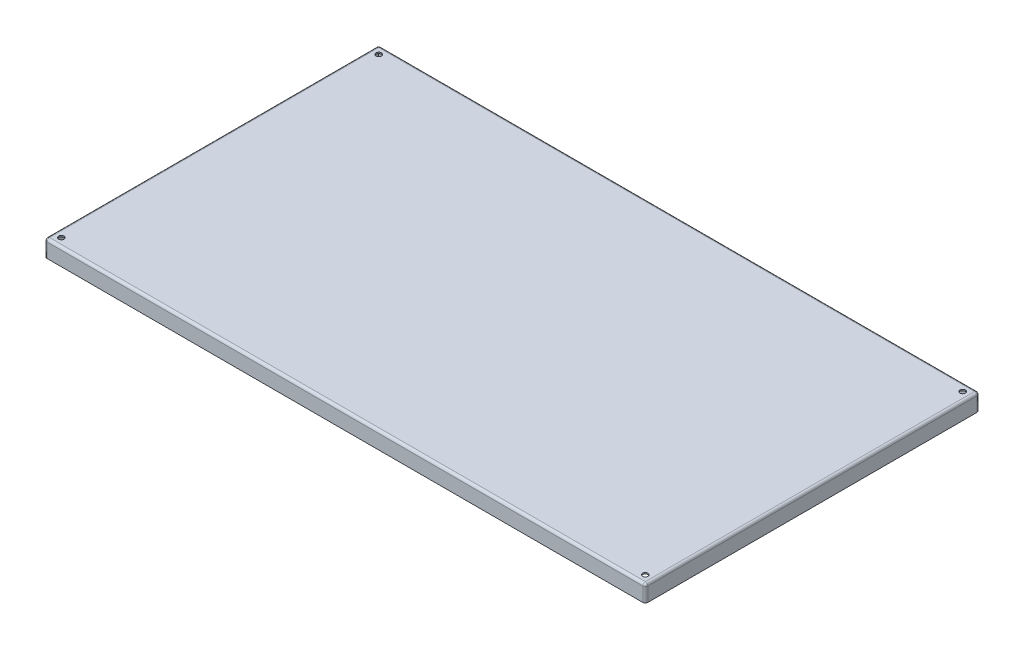
ISO-10303-21;
HEADER;
FILE_DESCRIPTION(('STEP AP214'),'2;1');
FILE_NAME('part.step','',(''),(''),'','','');
FILE_SCHEMA(('AUTOMOTIVE_DESIGN { 1 0 10303 214 1 1 1 1 }'));
ENDSEC;
DATA;
#1=APPLICATION_CONTEXT('core data for automotive mechanical design processes');
#2=APPLICATION_PROTOCOL_DEFINITION('international standard','automotive_design',2000,#1);
#3=PRODUCT_CONTEXT('',#1,'mechanical');
#4=PRODUCT('Part','Part','',(#3));
#5=PRODUCT_RELATED_PRODUCT_CATEGORY('part','',(#4));
#6=PRODUCT_DEFINITION_FORMATION('','',#4);
#7=PRODUCT_DEFINITION_CONTEXT('part definition',#1,'design');
#8=PRODUCT_DEFINITION('design','',#6,#7);
#9=PRODUCT_DEFINITION_SHAPE('','',#8);
#10=(LENGTH_UNIT() NAMED_UNIT(*) SI_UNIT(.MILLI.,.METRE.));
#11=(NAMED_UNIT(*) PLANE_ANGLE_UNIT() SI_UNIT($,.RADIAN.));
#12=(NAMED_UNIT(*) SI_UNIT($,.STERADIAN.) SOLID_ANGLE_UNIT());
#13=UNCERTAINTY_MEASURE_WITH_UNIT(LENGTH_MEASURE(1.E-05),#10,'distance_accuracy_value','');
#14=(GEOMETRIC_REPRESENTATION_CONTEXT(3) GLOBAL_UNCERTAINTY_ASSIGNED_CONTEXT((#13)) GLOBAL_UNIT_ASSIGNED_CONTEXT((#10,
#11,#12)) REPRESENTATION_CONTEXT('',''));
#15=CARTESIAN_POINT('',(0.,0.,0.));
#16=DIRECTION('',(0.,0.,1.));
#17=DIRECTION('',(1.,0.,0.));
#18=AXIS2_PLACEMENT_3D('',#15,#16,#17);
#19=CARTESIAN_POINT('',(-353.85,46.072,-195.5));
#20=DIRECTION('',(0.,-1.,0.));
#21=DIRECTION('',(0.,0.,-1.));
#22=AXIS2_PLACEMENT_3D('',#19,#20,#21);
#23=CYLINDRICAL_SURFACE('',#22,3.);
#24=CARTESIAN_POINT('',(-353.85,0.,-195.5));
#25=DIRECTION('',(0.,-1.,0.));
#26=DIRECTION('',(0.,0.,-1.));
#27=AXIS2_PLACEMENT_3D('',#24,#25,#26);
#28=CIRCLE('',#27,3.);
#29=CARTESIAN_POINT('',(-353.85,0.,-198.5));
#30=VERTEX_POINT('',#29);
#31=CARTESIAN_POINT('',(-356.85,0.,-195.5));
#32=VERTEX_POINT('',#31);
#33=EDGE_CURVE('E257',#30,#32,#28,.F.);
#34=ORIENTED_EDGE('',*,*,#33,.T.);
#35=DIRECTION('',(0.,1.,0.));
#36=VECTOR('',#35,1.);
#37=CARTESIAN_POINT('',(-356.85,0.,-195.5));
#38=LINE('',#37,#36);
#39=CARTESIAN_POINT('',(-356.85,17.0000000000202,-195.5));
#40=VERTEX_POINT('',#39);
#41=EDGE_CURVE('E177',#40,#32,#38,.F.);
#42=ORIENTED_EDGE('',*,*,#41,.F.);
#43=CARTESIAN_POINT('',(-353.85,17.,-195.5));
#44=DIRECTION('',(-1.34556481254872E-11,-1.,1.34648954890281E-11));
#45=DIRECTION('',(-0.707106781186566,1.9035698943052E-11,0.707106781186529));
#46=AXIS2_PLACEMENT_3D('',#43,#44,#45);
#47=CIRCLE('',#46,3.00000000000002);
#48=CARTESIAN_POINT('',(-355.97132034356,17.,-197.62132034356));
#49=VERTEX_POINT('',#48);
#50=EDGE_CURVE('E451',#49,#40,#47,.F.);
#51=ORIENTED_EDGE('',*,*,#50,.F.);
#52=CARTESIAN_POINT('',(-353.85,17.,-195.5));
#53=DIRECTION('',(-2.69147946998159E-11,-1.,0.));
#54=DIRECTION('',(-0.707106781186566,1.9035698943052E-11,0.707106781186529));
#55=AXIS2_PLACEMENT_3D('',#52,#53,#54);
#56=CIRCLE('',#55,3.00000000000002);
#57=CARTESIAN_POINT('',(-353.85,17.,-198.5));
#58=VERTEX_POINT('',#57);
#59=EDGE_CURVE('E307',#58,#49,#56,.F.);
#60=ORIENTED_EDGE('',*,*,#59,.F.);
#61=DIRECTION('',(0.,1.,0.));
#62=VECTOR('',#61,1.);
#63=CARTESIAN_POINT('',(-353.85,0.,-198.5));
#64=LINE('',#63,#62);
#65=EDGE_CURVE('E180',#30,#58,#64,.T.);
#66=ORIENTED_EDGE('',*,*,#65,.F.);
#67=EDGE_LOOP('',(#34,#42,#51,#60,#66));
#68=FACE_BOUND('',#67,.T.);
#69=ADVANCED_FACE('F17',(#68),#23,.T.);
#70=CARTESIAN_POINT('',(-353.85,46.072,195.5));
#71=DIRECTION('',(0.,-1.,0.));
#72=DIRECTION('',(0.,0.,-1.));
#73=AXIS2_PLACEMENT_3D('',#70,#71,#72);
#74=CYLINDRICAL_SURFACE('',#73,3.);
#75=DIRECTION('',(0.,1.,0.));
#76=VECTOR('',#75,1.);
#77=CARTESIAN_POINT('',(-356.85,0.,195.5));
#78=LINE('',#77,#76);
#79=CARTESIAN_POINT('',(-356.85,0.,195.5));
#80=VERTEX_POINT('',#79);
#81=CARTESIAN_POINT('',(-356.85,17.0000000000101,195.50000000001));
#82=VERTEX_POINT('',#81);
#83=EDGE_CURVE('E162',#80,#82,#78,.T.);
#84=ORIENTED_EDGE('',*,*,#83,.F.);
#85=CARTESIAN_POINT('',(-353.85,0.,195.5));
#86=DIRECTION('',(0.,-1.,0.));
#87=DIRECTION('',(0.,0.,-1.));
#88=AXIS2_PLACEMENT_3D('',#85,#86,#87);
#89=CIRCLE('',#88,3.);
#90=CARTESIAN_POINT('',(-353.85,0.,198.5));
#91=VERTEX_POINT('',#90);
#92=EDGE_CURVE('E20',#80,#91,#89,.F.);
#93=ORIENTED_EDGE('',*,*,#92,.T.);
#94=DIRECTION('',(0.,1.,0.));
#95=VECTOR('',#94,1.);
#96=CARTESIAN_POINT('',(-353.85,0.,198.5));
#97=LINE('',#96,#95);
#98=CARTESIAN_POINT('',(-353.85,17.,198.5));
#99=VERTEX_POINT('',#98);
#100=EDGE_CURVE('E150',#99,#91,#97,.F.);
#101=ORIENTED_EDGE('',*,*,#100,.F.);
#102=CARTESIAN_POINT('',(-353.85,17.,195.5));
#103=DIRECTION('',(0.,-1.,0.));
#104=DIRECTION('',(0.,0.,-1.));
#105=AXIS2_PLACEMENT_3D('',#102,#103,#104);
#106=CIRCLE('',#105,3.);
#107=EDGE_CURVE('E158',#82,#99,#106,.F.);
#108=ORIENTED_EDGE('',*,*,#107,.F.);
#109=EDGE_LOOP('',(#84,#93,#101,#108));
#110=FACE_BOUND('',#109,.T.);
#111=ADVANCED_FACE('F161',(#110),#74,.T.);
#112=CARTESIAN_POINT('',(353.85,46.072,195.5));
#113=DIRECTION('',(0.,-1.,0.));
#114=DIRECTION('',(0.,0.,-1.));
#115=AXIS2_PLACEMENT_3D('',#112,#113,#114);
#116=CYLINDRICAL_SURFACE('',#115,3.);
#117=DIRECTION('',(0.,1.,0.));
#118=VECTOR('',#117,1.);
#119=CARTESIAN_POINT('',(353.85,0.,198.5));
#120=LINE('',#119,#118);
#121=CARTESIAN_POINT('',(353.85,0.,198.5));
#122=VERTEX_POINT('',#121);
#123=CARTESIAN_POINT('',(353.85,17.,198.5));
#124=VERTEX_POINT('',#123);
#125=EDGE_CURVE('E167',#122,#124,#120,.T.);
#126=ORIENTED_EDGE('',*,*,#125,.F.);
#127=CARTESIAN_POINT('',(353.85,0.,195.5));
#128=DIRECTION('',(0.,-1.,0.));
#129=DIRECTION('',(0.,0.,-1.));
#130=AXIS2_PLACEMENT_3D('',#127,#128,#129);
#131=CIRCLE('',#130,3.);
#132=CARTESIAN_POINT('',(356.85,0.,195.5));
#133=VERTEX_POINT('',#132);
#134=EDGE_CURVE('E163',#122,#133,#131,.F.);
#135=ORIENTED_EDGE('',*,*,#134,.T.);
#136=DIRECTION('',(0.,1.,0.));
#137=VECTOR('',#136,1.);
#138=CARTESIAN_POINT('',(356.85,0.,195.5));
#139=LINE('',#138,#137);
#140=CARTESIAN_POINT('',(356.85,17.,195.5));
#141=VERTEX_POINT('',#140);
#142=EDGE_CURVE('E255',#141,#133,#139,.F.);
#143=ORIENTED_EDGE('',*,*,#142,.F.);
#144=CARTESIAN_POINT('',(353.85,17.,195.5));
#145=DIRECTION('',(0.,-1.,0.));
#146=DIRECTION('',(0.,0.,-1.));
#147=AXIS2_PLACEMENT_3D('',#144,#145,#146);
#148=CIRCLE('',#147,3.);
#149=EDGE_CURVE('E169',#124,#141,#148,.F.);
#150=ORIENTED_EDGE('',*,*,#149,.F.);
#151=EDGE_LOOP('',(#126,#135,#143,#150));
#152=FACE_BOUND('',#151,.T.);
#153=ADVANCED_FACE('F264',(#152),#116,.T.);
#154=CARTESIAN_POINT('',(353.85,46.072,-195.5));
#155=DIRECTION('',(0.,-1.,0.));
#156=DIRECTION('',(0.,0.,-1.));
#157=AXIS2_PLACEMENT_3D('',#154,#155,#156);
#158=CYLINDRICAL_SURFACE('',#157,3.);
#159=DIRECTION('',(0.,1.,0.));
#160=VECTOR('',#159,1.);
#161=CARTESIAN_POINT('',(356.85,0.,-195.5));
#162=LINE('',#161,#160);
#163=CARTESIAN_POINT('',(356.85,0.,-195.5));
#164=VERTEX_POINT('',#163);
#165=CARTESIAN_POINT('',(356.85,17.,-195.50000000023));
#166=VERTEX_POINT('',#165);
#167=EDGE_CURVE('E253',#164,#166,#162,.T.);
#168=ORIENTED_EDGE('',*,*,#167,.F.);
#169=CARTESIAN_POINT('',(353.85,0.,-195.5));
#170=DIRECTION('',(0.,-1.,0.));
#171=DIRECTION('',(0.,0.,-1.));
#172=AXIS2_PLACEMENT_3D('',#169,#170,#171);
#173=CIRCLE('',#172,3.);
#174=CARTESIAN_POINT('',(353.85,0.,-198.5));
#175=VERTEX_POINT('',#174);
#176=EDGE_CURVE('E260',#164,#175,#173,.F.);
#177=ORIENTED_EDGE('',*,*,#176,.T.);
#178=DIRECTION('',(0.,1.,0.));
#179=VECTOR('',#178,1.);
#180=CARTESIAN_POINT('',(353.85,0.,-198.5));
#181=LINE('',#180,#179);
#182=CARTESIAN_POINT('',(353.85,17.,-198.5));
#183=VERTEX_POINT('',#182);
#184=EDGE_CURVE('E181',#183,#175,#181,.F.);
#185=ORIENTED_EDGE('',*,*,#184,.F.);
#186=CARTESIAN_POINT('',(353.85,17.,-195.5));
#187=DIRECTION('',(0.,-1.,0.));
#188=DIRECTION('',(0.,0.,-1.));
#189=AXIS2_PLACEMENT_3D('',#186,#187,#188);
#190=CIRCLE('',#189,3.);
#191=EDGE_CURVE('E250',#166,#183,#190,.F.);
#192=ORIENTED_EDGE('',*,*,#191,.F.);
#193=EDGE_LOOP('',(#168,#177,#185,#192));
#194=FACE_BOUND('',#193,.T.);
#195=ADVANCED_FACE('F319',(#194),#158,.T.);
#196=CARTESIAN_POINT('',(0.,0.,0.));
#197=DIRECTION('',(0.,1.,0.));
#198=DIRECTION('',(0.,0.,1.));
#199=AXIS2_PLACEMENT_3D('',#196,#197,#198);
#200=PLANE('',#199);
#201=DIRECTION('',(-1.,0.,0.));
#202=VECTOR('',#201,1.);
#203=CARTESIAN_POINT('',(-336.85,0.,178.5));
#204=LINE('',#203,#202);
#205=CARTESIAN_POINT('',(336.85,0.,178.5));
#206=VERTEX_POINT('',#205);
#207=CARTESIAN_POINT('',(-336.85,0.,178.5));
#208=VERTEX_POINT('',#207);
#209=EDGE_CURVE('E726',#206,#208,#204,.T.);
#210=ORIENTED_EDGE('',*,*,#209,.F.);
#211=DIRECTION('',(0.,0.,1.));
#212=VECTOR('',#211,1.);
#213=CARTESIAN_POINT('',(336.85,0.,178.5));
#214=LINE('',#213,#212);
#215=CARTESIAN_POINT('',(336.85,0.,-178.5));
#216=VERTEX_POINT('',#215);
#217=EDGE_CURVE('E249',#216,#206,#214,.T.);
#218=ORIENTED_EDGE('',*,*,#217,.F.);
#219=DIRECTION('',(1.,0.,0.));
#220=VECTOR('',#219,1.);
#221=CARTESIAN_POINT('',(336.85,0.,-178.5));
#222=LINE('',#221,#220);
#223=CARTESIAN_POINT('',(-336.85,0.,-178.5));
#224=VERTEX_POINT('',#223);
#225=EDGE_CURVE('E252',#224,#216,#222,.T.);
#226=ORIENTED_EDGE('',*,*,#225,.F.);
#227=DIRECTION('',(0.,0.,-1.));
#228=VECTOR('',#227,1.);
#229=CARTESIAN_POINT('',(-336.85,0.,-178.5));
#230=LINE('',#229,#228);
#231=EDGE_CURVE('E731',#208,#224,#230,.T.);
#232=ORIENTED_EDGE('',*,*,#231,.F.);
#233=EDGE_LOOP('',(#210,#218,#226,#232));
#234=FACE_BOUND('',#233,.T.);
#235=CARTESIAN_POINT('',(346.85,0.,-188.5));
#236=DIRECTION('',(0.,-1.,0.));
#237=DIRECTION('',(0.,0.,-1.));
#238=AXIS2_PLACEMENT_3D('',#235,#236,#237);
#239=CIRCLE('',#238,3.25);
#240=CARTESIAN_POINT('',(346.85,0.,-191.75));
#241=VERTEX_POINT('',#240);
#242=EDGE_CURVE('E236',#241,#241,#239,.F.);
#243=ORIENTED_EDGE('',*,*,#242,.T.);
#244=EDGE_LOOP('',(#243));
#245=FACE_BOUND('',#244,.T.);
#246=CARTESIAN_POINT('',(-346.85,0.,-188.5));
#247=DIRECTION('',(0.,-1.,0.));
#248=DIRECTION('',(0.,0.,-1.));
#249=AXIS2_PLACEMENT_3D('',#246,#247,#248);
#250=CIRCLE('',#249,3.25);
#251=CARTESIAN_POINT('',(-346.85,0.,-191.75));
#252=VERTEX_POINT('',#251);
#253=EDGE_CURVE('E240',#252,#252,#250,.F.);
#254=ORIENTED_EDGE('',*,*,#253,.T.);
#255=EDGE_LOOP('',(#254));
#256=FACE_BOUND('',#255,.T.);
#257=CARTESIAN_POINT('',(346.85,0.,188.5));
#258=DIRECTION('',(0.,-1.,0.));
#259=DIRECTION('',(0.,0.,-1.));
#260=AXIS2_PLACEMENT_3D('',#257,#258,#259);
#261=CIRCLE('',#260,3.25);
#262=CARTESIAN_POINT('',(346.85,0.,185.25));
#263=VERTEX_POINT('',#262);
#264=EDGE_CURVE('E243',#263,#263,#261,.F.);
#265=ORIENTED_EDGE('',*,*,#264,.T.);
#266=EDGE_LOOP('',(#265));
#267=FACE_BOUND('',#266,.T.);
#268=CARTESIAN_POINT('',(-346.85,0.,188.5));
#269=DIRECTION('',(0.,-1.,0.));
#270=DIRECTION('',(0.,0.,-1.));
#271=AXIS2_PLACEMENT_3D('',#268,#269,#270);
#272=CIRCLE('',#271,3.25);
#273=CARTESIAN_POINT('',(-346.85,0.,185.25));
#274=VERTEX_POINT('',#273);
#275=EDGE_CURVE('E246',#274,#274,#272,.F.);
#276=ORIENTED_EDGE('',*,*,#275,.T.);
#277=EDGE_LOOP('',(#276));
#278=FACE_BOUND('',#277,.T.);
#279=ORIENTED_EDGE('',*,*,#33,.F.);
#280=DIRECTION('',(-1.,0.,0.));
#281=VECTOR('',#280,1.);
#282=CARTESIAN_POINT('',(356.85,0.,-198.5));
#283=LINE('',#282,#281);
#284=EDGE_CURVE('E178',#175,#30,#283,.T.);
#285=ORIENTED_EDGE('',*,*,#284,.F.);
#286=ORIENTED_EDGE('',*,*,#176,.F.);
#287=DIRECTION('',(0.,0.,-1.));
#288=VECTOR('',#287,1.);
#289=CARTESIAN_POINT('',(356.85,0.,198.5));
#290=LINE('',#289,#288);
#291=EDGE_CURVE('E173',#133,#164,#290,.T.);
#292=ORIENTED_EDGE('',*,*,#291,.F.);
#293=ORIENTED_EDGE('',*,*,#134,.F.);
#294=DIRECTION('',(1.,0.,0.));
#295=VECTOR('',#294,1.);
#296=CARTESIAN_POINT('',(-356.85,0.,198.5));
#297=LINE('',#296,#295);
#298=EDGE_CURVE('E152',#91,#122,#297,.T.);
#299=ORIENTED_EDGE('',*,*,#298,.F.);
#300=ORIENTED_EDGE('',*,*,#92,.F.);
#301=DIRECTION('',(0.,0.,1.));
#302=VECTOR('',#301,1.);
#303=CARTESIAN_POINT('',(-356.85,0.,-198.5));
#304=LINE('',#303,#302);
#305=EDGE_CURVE('E175',#32,#80,#304,.T.);
#306=ORIENTED_EDGE('',*,*,#305,.F.);
#307=EDGE_LOOP('',(#279,#285,#286,#292,#293,#299,#300,#306));
#308=FACE_BOUND('',#307,.T.);
#309=ADVANCED_FACE('F164',(#234,#245,#256,#267,#278,#308),#200,.F.);
#310=CARTESIAN_POINT('',(356.85,0.,-198.5));
#311=DIRECTION('',(0.,0.,-1.));
#312=DIRECTION('',(-1.,0.,0.));
#313=AXIS2_PLACEMENT_3D('',#310,#311,#312);
#314=PLANE('',#313);
#315=ORIENTED_EDGE('',*,*,#284,.T.);
#316=ORIENTED_EDGE('',*,*,#65,.T.);
#317=DIRECTION('',(-1.,0.,0.));
#318=VECTOR('',#317,1.);
#319=CARTESIAN_POINT('',(1287.22932,17.,-198.5));
#320=LINE('',#319,#318);
#321=EDGE_CURVE('E235',#183,#58,#320,.T.);
#322=ORIENTED_EDGE('',*,*,#321,.F.);
#323=ORIENTED_EDGE('',*,*,#184,.T.);
#324=EDGE_LOOP('',(#315,#316,#322,#323));
#325=FACE_BOUND('',#324,.T.);
#326=ADVANCED_FACE('F312',(#325),#314,.T.);
#327=CARTESIAN_POINT('',(-353.85,17.,-195.5));
#328=DIRECTION('',(-0.707106781186566,1.9035698943052E-11,0.707106781186529));
#329=DIRECTION('',(0.707106781186529,0.,0.707106781186566));
#330=AXIS2_PLACEMENT_3D('',#327,#328,#329);
#331=SPHERICAL_SURFACE('',#330,3.00000000000002);
#332=CARTESIAN_POINT('',(-353.85,17.,-195.5));
#333=DIRECTION('',(-1.,0.,0.));
#334=DIRECTION('',(0.,0.,1.));
#335=AXIS2_PLACEMENT_3D('',#332,#333,#334);
#336=CIRCLE('',#335,3.);
#337=CARTESIAN_POINT('',(-353.85,20.,-195.5));
#338=VERTEX_POINT('',#337);
#339=EDGE_CURVE('E233',#58,#338,#336,.F.);
#340=ORIENTED_EDGE('',*,*,#339,.F.);
#341=ORIENTED_EDGE('',*,*,#59,.T.);
#342=ORIENTED_EDGE('',*,*,#50,.T.);
#343=CARTESIAN_POINT('',(-353.85,17.,-195.5));
#344=DIRECTION('',(0.,0.,1.));
#345=DIRECTION('',(1.,0.,0.));
#346=AXIS2_PLACEMENT_3D('',#343,#344,#345);
#347=CIRCLE('',#346,3.);
#348=EDGE_CURVE('E227',#338,#40,#347,.T.);
#349=ORIENTED_EDGE('',*,*,#348,.F.);
#350=EDGE_LOOP('',(#340,#341,#342,#349));
#351=FACE_BOUND('',#350,.T.);
#352=ADVANCED_FACE('F309',(#351),#331,.T.);
#353=CARTESIAN_POINT('',(-356.85,0.,-198.5));
#354=DIRECTION('',(-1.,0.,0.));
#355=DIRECTION('',(0.,0.,1.));
#356=AXIS2_PLACEMENT_3D('',#353,#354,#355);
#357=PLANE('',#356);
#358=ORIENTED_EDGE('',*,*,#305,.T.);
#359=ORIENTED_EDGE('',*,*,#83,.T.);
#360=DIRECTION('',(0.,0.,1.));
#361=VECTOR('',#360,1.);
#362=CARTESIAN_POINT('',(-356.85,17.0000000000202,-716.0292));
#363=LINE('',#362,#361);
#364=EDGE_CURVE('E230',#40,#82,#363,.T.);
#365=ORIENTED_EDGE('',*,*,#364,.F.);
#366=ORIENTED_EDGE('',*,*,#41,.T.);
#367=EDGE_LOOP('',(#358,#359,#365,#366));
#368=FACE_BOUND('',#367,.T.);
#369=ADVANCED_FACE('F295',(#368),#357,.T.);
#370=CARTESIAN_POINT('',(-353.85,17.,195.5));
#371=DIRECTION('',(1.29526019539602E-13,0.70710678118653,-0.707106781186565));
#372=DIRECTION('',(0.,-0.707106781186565,-0.70710678118653));
#373=AXIS2_PLACEMENT_3D('',#370,#371,#372);
#374=SPHERICAL_SURFACE('',#373,3.);
#375=CARTESIAN_POINT('',(-353.85,17.,195.50000000002));
#376=DIRECTION('',(0.,0.,1.));
#377=DIRECTION('',(1.,0.,0.));
#378=AXIS2_PLACEMENT_3D('',#375,#376,#377);
#379=CIRCLE('',#378,3.);
#380=CARTESIAN_POINT('',(-353.85,20.,195.50000000001));
#381=VERTEX_POINT('',#380);
#382=EDGE_CURVE('E231',#82,#381,#379,.F.);
#383=ORIENTED_EDGE('',*,*,#382,.F.);
#384=ORIENTED_EDGE('',*,*,#107,.T.);
#385=CARTESIAN_POINT('',(-353.85,17.,195.5));
#386=DIRECTION('',(1.,0.,0.));
#387=DIRECTION('',(0.,0.,-1.));
#388=AXIS2_PLACEMENT_3D('',#385,#386,#387);
#389=CIRCLE('',#388,3.);
#390=EDGE_CURVE('E301',#381,#99,#389,.T.);
#391=ORIENTED_EDGE('',*,*,#390,.F.);
#392=EDGE_LOOP('',(#383,#384,#391));
#393=FACE_BOUND('',#392,.T.);
#394=ADVANCED_FACE('F291',(#393),#374,.T.);
#395=CARTESIAN_POINT('',(-356.85,0.,198.5));
#396=DIRECTION('',(0.,0.,1.));
#397=DIRECTION('',(1.,0.,0.));
#398=AXIS2_PLACEMENT_3D('',#395,#396,#397);
#399=PLANE('',#398);
#400=ORIENTED_EDGE('',*,*,#298,.T.);
#401=ORIENTED_EDGE('',*,*,#125,.T.);
#402=DIRECTION('',(1.,0.,0.));
#403=VECTOR('',#402,1.);
#404=CARTESIAN_POINT('',(-1287.22932,17.,198.5));
#405=LINE('',#404,#403);
#406=EDGE_CURVE('E155',#99,#124,#405,.T.);
#407=ORIENTED_EDGE('',*,*,#406,.F.);
#408=ORIENTED_EDGE('',*,*,#100,.T.);
#409=EDGE_LOOP('',(#400,#401,#407,#408));
#410=FACE_BOUND('',#409,.T.);
#411=ADVANCED_FACE('F151',(#410),#399,.T.);
#412=CARTESIAN_POINT('',(353.85,17.0000000000001,195.5));
#413=DIRECTION('',(0.70710678118655,-0.707106781186545,0.));
#414=DIRECTION('',(-0.707106781186545,-0.70710678118655,0.));
#415=AXIS2_PLACEMENT_3D('',#412,#413,#414);
#416=SPHERICAL_SURFACE('',#415,2.99999999999992);
#417=CARTESIAN_POINT('',(353.85,17.,195.5));
#418=DIRECTION('',(1.,0.,0.));
#419=DIRECTION('',(0.,0.,-1.));
#420=AXIS2_PLACEMENT_3D('',#417,#418,#419);
#421=CIRCLE('',#420,3.);
#422=CARTESIAN_POINT('',(353.85,20.,195.5));
#423=VERTEX_POINT('',#422);
#424=EDGE_CURVE('E224',#124,#423,#421,.F.);
#425=ORIENTED_EDGE('',*,*,#424,.F.);
#426=ORIENTED_EDGE('',*,*,#149,.T.);
#427=CARTESIAN_POINT('',(353.85,17.,195.5));
#428=DIRECTION('',(0.,0.,-1.));
#429=DIRECTION('',(-1.,0.,0.));
#430=AXIS2_PLACEMENT_3D('',#427,#428,#429);
#431=CIRCLE('',#430,3.);
#432=EDGE_CURVE('E226',#423,#141,#431,.T.);
#433=ORIENTED_EDGE('',*,*,#432,.F.);
#434=EDGE_LOOP('',(#425,#426,#433));
#435=FACE_BOUND('',#434,.T.);
#436=ADVANCED_FACE('F282',(#435),#416,.T.);
#437=CARTESIAN_POINT('',(356.85,0.,198.5));
#438=DIRECTION('',(1.,0.,0.));
#439=DIRECTION('',(0.,0.,-1.));
#440=AXIS2_PLACEMENT_3D('',#437,#438,#439);
#441=PLANE('',#440);
#442=ORIENTED_EDGE('',*,*,#167,.T.);
#443=DIRECTION('',(0.,0.,-1.));
#444=VECTOR('',#443,1.);
#445=CARTESIAN_POINT('',(356.85,17.,716.0292));
#446=LINE('',#445,#444);
#447=EDGE_CURVE('E223',#141,#166,#446,.T.);
#448=ORIENTED_EDGE('',*,*,#447,.F.);
#449=ORIENTED_EDGE('',*,*,#142,.T.);
#450=ORIENTED_EDGE('',*,*,#291,.T.);
#451=EDGE_LOOP('',(#442,#448,#449,#450));
#452=FACE_BOUND('',#451,.T.);
#453=ADVANCED_FACE('F286',(#452),#441,.T.);
#454=CARTESIAN_POINT('',(353.85,17.,-195.5));
#455=DIRECTION('',(-1.,0.,0.));
#456=DIRECTION('',(0.,-0.707106781186546,0.707106781186549));
#457=AXIS2_PLACEMENT_3D('',#454,#455,#456);
#458=SPHERICAL_SURFACE('',#457,2.99999999999998);
#459=CARTESIAN_POINT('',(353.85,17.,-195.500000000459));
#460=DIRECTION('',(0.,0.,-1.));
#461=DIRECTION('',(-1.,0.,0.));
#462=AXIS2_PLACEMENT_3D('',#459,#460,#461);
#463=CIRCLE('',#462,3.);
#464=CARTESIAN_POINT('',(353.85,20.,-195.50000000023));
#465=VERTEX_POINT('',#464);
#466=EDGE_CURVE('E220',#166,#465,#463,.F.);
#467=ORIENTED_EDGE('',*,*,#466,.F.);
#468=ORIENTED_EDGE('',*,*,#191,.T.);
#469=CARTESIAN_POINT('',(353.85,17.,-195.5));
#470=DIRECTION('',(-1.,0.,0.));
#471=DIRECTION('',(0.,0.,1.));
#472=AXIS2_PLACEMENT_3D('',#469,#470,#471);
#473=CIRCLE('',#472,3.);
#474=EDGE_CURVE('E239',#465,#183,#473,.T.);
#475=ORIENTED_EDGE('',*,*,#474,.F.);
#476=EDGE_LOOP('',(#467,#468,#475));
#477=FACE_BOUND('',#476,.T.);
#478=ADVANCED_FACE('F425',(#477),#458,.T.);
#479=CARTESIAN_POINT('',(336.85,0.,-178.5));
#480=DIRECTION('',(0.,0.,1.));
#481=DIRECTION('',(1.,0.,0.));
#482=AXIS2_PLACEMENT_3D('',#479,#480,#481);
#483=PLANE('',#482);
#484=DIRECTION('',(0.,1.,0.));
#485=VECTOR('',#484,1.);
#486=CARTESIAN_POINT('',(-336.85,0.,-178.5));
#487=LINE('',#486,#485);
#488=CARTESIAN_POINT('',(-336.85,1.5,-178.5));
#489=VERTEX_POINT('',#488);
#490=EDGE_CURVE('E733',#224,#489,#487,.T.);
#491=ORIENTED_EDGE('',*,*,#490,.F.);
#492=ORIENTED_EDGE('',*,*,#225,.T.);
#493=DIRECTION('',(0.,1.,0.));
#494=VECTOR('',#493,1.);
#495=CARTESIAN_POINT('',(336.85,0.,-178.5));
#496=LINE('',#495,#494);
#497=CARTESIAN_POINT('',(336.85,1.5,-178.5));
#498=VERTEX_POINT('',#497);
#499=EDGE_CURVE('E721',#498,#216,#496,.F.);
#500=ORIENTED_EDGE('',*,*,#499,.F.);
#501=DIRECTION('',(1.,0.,0.));
#502=VECTOR('',#501,1.);
#503=CARTESIAN_POINT('',(0.,1.5,-178.5));
#504=LINE('',#503,#502);
#505=EDGE_CURVE('E222',#498,#489,#504,.F.);
#506=ORIENTED_EDGE('',*,*,#505,.T.);
#507=EDGE_LOOP('',(#491,#492,#500,#506));
#508=FACE_BOUND('',#507,.T.);
#509=ADVANCED_FACE('F422',(#508),#483,.T.);
#510=CARTESIAN_POINT('',(-336.85,0.,-178.5));
#511=DIRECTION('',(1.,0.,0.));
#512=DIRECTION('',(0.,0.,-1.));
#513=AXIS2_PLACEMENT_3D('',#510,#511,#512);
#514=PLANE('',#513);
#515=DIRECTION('',(0.,1.,0.));
#516=VECTOR('',#515,1.);
#517=CARTESIAN_POINT('',(-336.85,0.,178.5));
#518=LINE('',#517,#516);
#519=CARTESIAN_POINT('',(-336.85,1.5,178.5));
#520=VERTEX_POINT('',#519);
#521=EDGE_CURVE('E729',#208,#520,#518,.T.);
#522=ORIENTED_EDGE('',*,*,#521,.F.);
#523=ORIENTED_EDGE('',*,*,#231,.T.);
#524=ORIENTED_EDGE('',*,*,#490,.T.);
#525=DIRECTION('',(0.,0.,-1.));
#526=VECTOR('',#525,1.);
#527=CARTESIAN_POINT('',(-336.85,1.5,0.));
#528=LINE('',#527,#526);
#529=EDGE_CURVE('E714',#489,#520,#528,.F.);
#530=ORIENTED_EDGE('',*,*,#529,.T.);
#531=EDGE_LOOP('',(#522,#523,#524,#530));
#532=FACE_BOUND('',#531,.T.);
#533=ADVANCED_FACE('F418',(#532),#514,.T.);
#534=CARTESIAN_POINT('',(-336.85,0.,178.5));
#535=DIRECTION('',(0.,0.,-1.));
#536=DIRECTION('',(-1.,0.,0.));
#537=AXIS2_PLACEMENT_3D('',#534,#535,#536);
#538=PLANE('',#537);
#539=DIRECTION('',(0.,1.,0.));
#540=VECTOR('',#539,1.);
#541=CARTESIAN_POINT('',(336.85,0.,178.5));
#542=LINE('',#541,#540);
#543=CARTESIAN_POINT('',(336.85,1.5,178.5));
#544=VERTEX_POINT('',#543);
#545=EDGE_CURVE('E724',#206,#544,#542,.T.);
#546=ORIENTED_EDGE('',*,*,#545,.F.);
#547=ORIENTED_EDGE('',*,*,#209,.T.);
#548=ORIENTED_EDGE('',*,*,#521,.T.);
#549=DIRECTION('',(1.,0.,0.));
#550=VECTOR('',#549,1.);
#551=CARTESIAN_POINT('',(0.,1.5,178.5));
#552=LINE('',#551,#550);
#553=EDGE_CURVE('E711',#520,#544,#552,.T.);
#554=ORIENTED_EDGE('',*,*,#553,.T.);
#555=EDGE_LOOP('',(#546,#547,#548,#554));
#556=FACE_BOUND('',#555,.T.);
#557=ADVANCED_FACE('F414',(#556),#538,.T.);
#558=CARTESIAN_POINT('',(336.85,0.,178.5));
#559=DIRECTION('',(-1.,0.,0.));
#560=DIRECTION('',(0.,0.,1.));
#561=AXIS2_PLACEMENT_3D('',#558,#559,#560);
#562=PLANE('',#561);
#563=ORIENTED_EDGE('',*,*,#499,.T.);
#564=ORIENTED_EDGE('',*,*,#217,.T.);
#565=ORIENTED_EDGE('',*,*,#545,.T.);
#566=DIRECTION('',(0.,0.,-1.));
#567=VECTOR('',#566,1.);
#568=CARTESIAN_POINT('',(336.85,1.5,0.));
#569=LINE('',#568,#567);
#570=EDGE_CURVE('E219',#544,#498,#569,.T.);
#571=ORIENTED_EDGE('',*,*,#570,.T.);
#572=EDGE_LOOP('',(#563,#564,#565,#571));
#573=FACE_BOUND('',#572,.T.);
#574=ADVANCED_FACE('F410',(#573),#562,.T.);
#575=CARTESIAN_POINT('',(-346.85,0.,188.5));
#576=DIRECTION('',(0.,-1.,0.));
#577=DIRECTION('',(0.,0.,-1.));
#578=AXIS2_PLACEMENT_3D('',#575,#576,#577);
#579=CYLINDRICAL_SURFACE('',#578,3.25);
#580=ORIENTED_EDGE('',*,*,#275,.F.);
#581=EDGE_LOOP('',(#580));
#582=FACE_BOUND('',#581,.T.);
#583=CARTESIAN_POINT('',(-346.85,1.5,188.5));
#584=DIRECTION('',(0.,-1.,0.));
#585=DIRECTION('',(0.,0.,-1.));
#586=AXIS2_PLACEMENT_3D('',#583,#584,#585);
#587=CIRCLE('',#586,3.25);
#588=CARTESIAN_POINT('',(-346.85,1.5,185.25));
#589=VERTEX_POINT('',#588);
#590=EDGE_CURVE('E216',#589,#589,#587,.F.);
#591=ORIENTED_EDGE('',*,*,#590,.T.);
#592=EDGE_LOOP('',(#591));
#593=FACE_BOUND('',#592,.T.);
#594=ADVANCED_FACE('F406',(#582,#593),#579,.F.);
#595=CARTESIAN_POINT('',(346.85,0.,188.5));
#596=DIRECTION('',(0.,-1.,0.));
#597=DIRECTION('',(0.,0.,-1.));
#598=AXIS2_PLACEMENT_3D('',#595,#596,#597);
#599=CYLINDRICAL_SURFACE('',#598,3.25);
#600=ORIENTED_EDGE('',*,*,#264,.F.);
#601=EDGE_LOOP('',(#600));
#602=FACE_BOUND('',#601,.T.);
#603=CARTESIAN_POINT('',(346.85,1.5,188.5));
#604=DIRECTION('',(0.,-1.,0.));
#605=DIRECTION('',(0.,0.,-1.));
#606=AXIS2_PLACEMENT_3D('',#603,#604,#605);
#607=CIRCLE('',#606,3.25);
#608=CARTESIAN_POINT('',(346.85,1.5,185.25));
#609=VERTEX_POINT('',#608);
#610=EDGE_CURVE('E213',#609,#609,#607,.F.);
#611=ORIENTED_EDGE('',*,*,#610,.T.);
#612=EDGE_LOOP('',(#611));
#613=FACE_BOUND('',#612,.T.);
#614=ADVANCED_FACE('F402',(#602,#613),#599,.F.);
#615=CARTESIAN_POINT('',(-346.85,0.,-188.5));
#616=DIRECTION('',(0.,-1.,0.));
#617=DIRECTION('',(0.,0.,-1.));
#618=AXIS2_PLACEMENT_3D('',#615,#616,#617);
#619=CYLINDRICAL_SURFACE('',#618,3.25);
#620=ORIENTED_EDGE('',*,*,#253,.F.);
#621=EDGE_LOOP('',(#620));
#622=FACE_BOUND('',#621,.T.);
#623=CARTESIAN_POINT('',(-346.85,1.5,-188.5));
#624=DIRECTION('',(0.,-1.,0.));
#625=DIRECTION('',(0.,0.,-1.));
#626=AXIS2_PLACEMENT_3D('',#623,#624,#625);
#627=CIRCLE('',#626,3.25);
#628=CARTESIAN_POINT('',(-346.85,1.5,-191.75));
#629=VERTEX_POINT('',#628);
#630=EDGE_CURVE('E210',#629,#629,#627,.F.);
#631=ORIENTED_EDGE('',*,*,#630,.T.);
#632=EDGE_LOOP('',(#631));
#633=FACE_BOUND('',#632,.T.);
#634=ADVANCED_FACE('F398',(#622,#633),#619,.F.);
#635=CARTESIAN_POINT('',(346.85,0.,-188.5));
#636=DIRECTION('',(0.,-1.,0.));
#637=DIRECTION('',(0.,0.,-1.));
#638=AXIS2_PLACEMENT_3D('',#635,#636,#637);
#639=CYLINDRICAL_SURFACE('',#638,3.25);
#640=ORIENTED_EDGE('',*,*,#242,.F.);
#641=EDGE_LOOP('',(#640));
#642=FACE_BOUND('',#641,.T.);
#643=CARTESIAN_POINT('',(346.85,1.5,-188.5));
#644=DIRECTION('',(0.,-1.,0.));
#645=DIRECTION('',(0.,0.,-1.));
#646=AXIS2_PLACEMENT_3D('',#643,#644,#645);
#647=CIRCLE('',#646,3.25);
#648=CARTESIAN_POINT('',(346.85,1.5,-191.75));
#649=VERTEX_POINT('',#648);
#650=EDGE_CURVE('E206',#649,#649,#647,.F.);
#651=ORIENTED_EDGE('',*,*,#650,.T.);
#652=EDGE_LOOP('',(#651));
#653=FACE_BOUND('',#652,.T.);
#654=ADVANCED_FACE('F394',(#642,#653),#639,.F.);
#655=CARTESIAN_POINT('',(1287.22932,17.,-195.5));
#656=DIRECTION('',(-1.,0.,0.));
#657=DIRECTION('',(0.,0.,1.));
#658=AXIS2_PLACEMENT_3D('',#655,#656,#657);
#659=CYLINDRICAL_SURFACE('',#658,3.);
#660=ORIENTED_EDGE('',*,*,#339,.T.);
#661=DIRECTION('',(1.,0.,0.));
#662=VECTOR('',#661,1.);
#663=CARTESIAN_POINT('',(0.,20.,-195.5));
#664=LINE('',#663,#662);
#665=EDGE_CURVE('E209',#465,#338,#664,.F.);
#666=ORIENTED_EDGE('',*,*,#665,.F.);
#667=ORIENTED_EDGE('',*,*,#474,.T.);
#668=ORIENTED_EDGE('',*,*,#321,.T.);
#669=EDGE_LOOP('',(#660,#666,#667,#668));
#670=FACE_BOUND('',#669,.T.);
#671=ADVANCED_FACE('F390',(#670),#659,.T.);
#672=CARTESIAN_POINT('',(-353.85,17.,-716.0292));
#673=DIRECTION('',(0.,0.,1.));
#674=DIRECTION('',(1.,0.,0.));
#675=AXIS2_PLACEMENT_3D('',#672,#673,#674);
#676=CYLINDRICAL_SURFACE('',#675,3.);
#677=ORIENTED_EDGE('',*,*,#348,.T.);
#678=ORIENTED_EDGE('',*,*,#364,.T.);
#679=ORIENTED_EDGE('',*,*,#382,.T.);
#680=DIRECTION('',(0.,0.,1.));
#681=VECTOR('',#680,1.);
#682=CARTESIAN_POINT('',(-353.85,20.,0.));
#683=LINE('',#682,#681);
#684=EDGE_CURVE('E302',#338,#381,#683,.T.);
#685=ORIENTED_EDGE('',*,*,#684,.F.);
#686=EDGE_LOOP('',(#677,#678,#679,#685));
#687=FACE_BOUND('',#686,.T.);
#688=ADVANCED_FACE('F386',(#687),#676,.T.);
#689=CARTESIAN_POINT('',(-1287.22932,17.,195.5));
#690=DIRECTION('',(1.,0.,0.));
#691=DIRECTION('',(0.,0.,-1.));
#692=AXIS2_PLACEMENT_3D('',#689,#690,#691);
#693=CYLINDRICAL_SURFACE('',#692,3.);
#694=ORIENTED_EDGE('',*,*,#406,.T.);
#695=ORIENTED_EDGE('',*,*,#424,.T.);
#696=DIRECTION('',(1.,0.,0.));
#697=VECTOR('',#696,1.);
#698=CARTESIAN_POINT('',(0.,20.,195.5));
#699=LINE('',#698,#697);
#700=EDGE_CURVE('E279',#381,#423,#699,.T.);
#701=ORIENTED_EDGE('',*,*,#700,.F.);
#702=ORIENTED_EDGE('',*,*,#390,.T.);
#703=EDGE_LOOP('',(#694,#695,#701,#702));
#704=FACE_BOUND('',#703,.T.);
#705=ADVANCED_FACE('F382',(#704),#693,.T.);
#706=CARTESIAN_POINT('',(353.85,17.,716.0292));
#707=DIRECTION('',(0.,0.,-1.));
#708=DIRECTION('',(-1.,0.,0.));
#709=AXIS2_PLACEMENT_3D('',#706,#707,#708);
#710=CYLINDRICAL_SURFACE('',#709,3.);
#711=ORIENTED_EDGE('',*,*,#447,.T.);
#712=ORIENTED_EDGE('',*,*,#466,.T.);
#713=DIRECTION('',(0.,0.,1.));
#714=VECTOR('',#713,1.);
#715=CARTESIAN_POINT('',(353.85,20.,0.));
#716=LINE('',#715,#714);
#717=EDGE_CURVE('E438',#423,#465,#716,.F.);
#718=ORIENTED_EDGE('',*,*,#717,.F.);
#719=ORIENTED_EDGE('',*,*,#432,.T.);
#720=EDGE_LOOP('',(#711,#712,#718,#719));
#721=FACE_BOUND('',#720,.T.);
#722=ADVANCED_FACE('F378',(#721),#710,.T.);
#723=CARTESIAN_POINT('',(0.,1.5,0.));
#724=DIRECTION('',(0.,-1.,0.));
#725=DIRECTION('',(0.,0.,-1.));
#726=AXIS2_PLACEMENT_3D('',#723,#724,#725);
#727=PLANE('',#726);
#728=ORIENTED_EDGE('',*,*,#650,.F.);
#729=EDGE_LOOP('',(#728));
#730=FACE_BOUND('',#729,.T.);
#731=ORIENTED_EDGE('',*,*,#630,.F.);
#732=EDGE_LOOP('',(#731));
#733=FACE_BOUND('',#732,.T.);
#734=ORIENTED_EDGE('',*,*,#610,.F.);
#735=EDGE_LOOP('',(#734));
#736=FACE_BOUND('',#735,.T.);
#737=ORIENTED_EDGE('',*,*,#590,.F.);
#738=EDGE_LOOP('',(#737));
#739=FACE_BOUND('',#738,.T.);
#740=ORIENTED_EDGE('',*,*,#553,.F.);
#741=ORIENTED_EDGE('',*,*,#529,.F.);
#742=ORIENTED_EDGE('',*,*,#505,.F.);
#743=ORIENTED_EDGE('',*,*,#570,.F.);
#744=EDGE_LOOP('',(#740,#741,#742,#743));
#745=FACE_BOUND('',#744,.T.);
#746=DIRECTION('',(0.,0.,1.));
#747=VECTOR('',#746,1.);
#748=CARTESIAN_POINT('',(-355.35,1.5,-198.5));
#749=LINE('',#748,#747);
#750=CARTESIAN_POINT('',(-355.35,1.5,-197.));
#751=VERTEX_POINT('',#750);
#752=CARTESIAN_POINT('',(-355.35,1.5,197.));
#753=VERTEX_POINT('',#752);
#754=EDGE_CURVE('E745',#751,#753,#749,.T.);
#755=ORIENTED_EDGE('',*,*,#754,.T.);
#756=DIRECTION('',(1.,0.,0.));
#757=VECTOR('',#756,1.);
#758=CARTESIAN_POINT('',(-356.85,1.5,197.));
#759=LINE('',#758,#757);
#760=CARTESIAN_POINT('',(355.35,1.5,197.));
#761=VERTEX_POINT('',#760);
#762=EDGE_CURVE('E746',#753,#761,#759,.T.);
#763=ORIENTED_EDGE('',*,*,#762,.T.);
#764=DIRECTION('',(0.,0.,-1.));
#765=VECTOR('',#764,1.);
#766=CARTESIAN_POINT('',(355.35,1.5,198.5));
#767=LINE('',#766,#765);
#768=CARTESIAN_POINT('',(355.35,1.5,-197.));
#769=VERTEX_POINT('',#768);
#770=EDGE_CURVE('E440',#761,#769,#767,.T.);
#771=ORIENTED_EDGE('',*,*,#770,.T.);
#772=DIRECTION('',(-1.,0.,0.));
#773=VECTOR('',#772,1.);
#774=CARTESIAN_POINT('',(356.85,1.5,-197.));
#775=LINE('',#774,#773);
#776=EDGE_CURVE('E705',#769,#751,#775,.T.);
#777=ORIENTED_EDGE('',*,*,#776,.T.);
#778=EDGE_LOOP('',(#755,#763,#771,#777));
#779=FACE_BOUND('',#778,.T.);
#780=ADVANCED_FACE('F374',(#730,#733,#736,#739,#745,#779),#727,.F.);
#781=CARTESIAN_POINT('',(0.,20.,0.));
#782=DIRECTION('',(0.,1.,0.));
#783=DIRECTION('',(0.,0.,1.));
#784=AXIS2_PLACEMENT_3D('',#781,#782,#783);
#785=PLANE('',#784);
#786=CARTESIAN_POINT('',(-346.85,20.,188.5));
#787=DIRECTION('',(0.,-1.,0.));
#788=DIRECTION('',(0.,0.,-1.));
#789=AXIS2_PLACEMENT_3D('',#786,#787,#788);
#790=CIRCLE('',#789,3.25);
#791=CARTESIAN_POINT('',(-346.85,20.,185.25));
#792=VERTEX_POINT('',#791);
#793=EDGE_CURVE('E202',#792,#792,#790,.T.);
#794=ORIENTED_EDGE('',*,*,#793,.T.);
#795=EDGE_LOOP('',(#794));
#796=FACE_BOUND('',#795,.T.);
#797=CARTESIAN_POINT('',(346.85,20.,-188.5));
#798=DIRECTION('',(0.,-1.,0.));
#799=DIRECTION('',(0.,0.,-1.));
#800=AXIS2_PLACEMENT_3D('',#797,#798,#799);
#801=CIRCLE('',#800,3.25);
#802=CARTESIAN_POINT('',(346.85,20.,-191.75));
#803=VERTEX_POINT('',#802);
#804=EDGE_CURVE('E192',#803,#803,#801,.T.);
#805=ORIENTED_EDGE('',*,*,#804,.T.);
#806=EDGE_LOOP('',(#805));
#807=FACE_BOUND('',#806,.T.);
#808=CARTESIAN_POINT('',(-346.85,20.,-188.5));
#809=DIRECTION('',(0.,-1.,0.));
#810=DIRECTION('',(0.,0.,-1.));
#811=AXIS2_PLACEMENT_3D('',#808,#809,#810);
#812=CIRCLE('',#811,3.25);
#813=CARTESIAN_POINT('',(-346.85,20.,-191.75));
#814=VERTEX_POINT('',#813);
#815=EDGE_CURVE('E196',#814,#814,#812,.T.);
#816=ORIENTED_EDGE('',*,*,#815,.T.);
#817=EDGE_LOOP('',(#816));
#818=FACE_BOUND('',#817,.T.);
#819=CARTESIAN_POINT('',(346.85,20.,188.5));
#820=DIRECTION('',(0.,-1.,0.));
#821=DIRECTION('',(0.,0.,-1.));
#822=AXIS2_PLACEMENT_3D('',#819,#820,#821);
#823=CIRCLE('',#822,3.25);
#824=CARTESIAN_POINT('',(346.85,20.,185.25));
#825=VERTEX_POINT('',#824);
#826=EDGE_CURVE('E199',#825,#825,#823,.T.);
#827=ORIENTED_EDGE('',*,*,#826,.T.);
#828=EDGE_LOOP('',(#827));
#829=FACE_BOUND('',#828,.T.);
#830=ORIENTED_EDGE('',*,*,#700,.T.);
#831=ORIENTED_EDGE('',*,*,#717,.T.);
#832=ORIENTED_EDGE('',*,*,#665,.T.);
#833=ORIENTED_EDGE('',*,*,#684,.T.);
#834=EDGE_LOOP('',(#830,#831,#832,#833));
#835=FACE_BOUND('',#834,.T.);
#836=ADVANCED_FACE('F370',(#796,#807,#818,#829,#835),#785,.T.);
#837=CARTESIAN_POINT('',(355.35,0.,198.5));
#838=DIRECTION('',(1.,0.,0.));
#839=DIRECTION('',(0.,0.,-1.));
#840=AXIS2_PLACEMENT_3D('',#837,#838,#839);
#841=PLANE('',#840);
#842=ORIENTED_EDGE('',*,*,#770,.F.);
#843=DIRECTION('',(0.,1.,0.));
#844=VECTOR('',#843,1.);
#845=CARTESIAN_POINT('',(355.35,0.,197.));
#846=LINE('',#845,#844);
#847=CARTESIAN_POINT('',(355.35,18.5,197.));
#848=VERTEX_POINT('',#847);
#849=EDGE_CURVE('E205',#761,#848,#846,.T.);
#850=ORIENTED_EDGE('',*,*,#849,.T.);
#851=DIRECTION('',(0.,0.,1.));
#852=VECTOR('',#851,1.);
#853=CARTESIAN_POINT('',(355.35,18.5,0.));
#854=LINE('',#853,#852);
#855=CARTESIAN_POINT('',(355.35,18.5,-197.));
#856=VERTEX_POINT('',#855);
#857=EDGE_CURVE('E195',#848,#856,#854,.F.);
#858=ORIENTED_EDGE('',*,*,#857,.T.);
#859=DIRECTION('',(0.,1.,0.));
#860=VECTOR('',#859,1.);
#861=CARTESIAN_POINT('',(355.35,0.,-197.));
#862=LINE('',#861,#860);
#863=EDGE_CURVE('E699',#856,#769,#862,.F.);
#864=ORIENTED_EDGE('',*,*,#863,.T.);
#865=EDGE_LOOP('',(#842,#850,#858,#864));
#866=FACE_BOUND('',#865,.T.);
#867=ADVANCED_FACE('F366',(#866),#841,.F.);
#868=CARTESIAN_POINT('',(356.85,0.,-197.));
#869=DIRECTION('',(0.,0.,-1.));
#870=DIRECTION('',(-1.,0.,0.));
#871=AXIS2_PLACEMENT_3D('',#868,#869,#870);
#872=PLANE('',#871);
#873=ORIENTED_EDGE('',*,*,#776,.F.);
#874=ORIENTED_EDGE('',*,*,#863,.F.);
#875=DIRECTION('',(1.,0.,0.));
#876=VECTOR('',#875,1.);
#877=CARTESIAN_POINT('',(0.,18.5,-197.));
#878=LINE('',#877,#876);
#879=CARTESIAN_POINT('',(-355.35,18.5,-197.));
#880=VERTEX_POINT('',#879);
#881=EDGE_CURVE('E761',#856,#880,#878,.F.);
#882=ORIENTED_EDGE('',*,*,#881,.T.);
#883=DIRECTION('',(0.,1.,0.));
#884=VECTOR('',#883,1.);
#885=CARTESIAN_POINT('',(-355.35,0.,-197.));
#886=LINE('',#885,#884);
#887=EDGE_CURVE('E748',#880,#751,#886,.F.);
#888=ORIENTED_EDGE('',*,*,#887,.T.);
#889=EDGE_LOOP('',(#873,#874,#882,#888));
#890=FACE_BOUND('',#889,.T.);
#891=ADVANCED_FACE('F362',(#890),#872,.F.);
#892=CARTESIAN_POINT('',(-355.35,0.,-198.5));
#893=DIRECTION('',(-1.,0.,0.));
#894=DIRECTION('',(0.,0.,1.));
#895=AXIS2_PLACEMENT_3D('',#892,#893,#894);
#896=PLANE('',#895);
#897=ORIENTED_EDGE('',*,*,#754,.F.);
#898=ORIENTED_EDGE('',*,*,#887,.F.);
#899=DIRECTION('',(0.,0.,1.));
#900=VECTOR('',#899,1.);
#901=CARTESIAN_POINT('',(-355.35,18.5,0.));
#902=LINE('',#901,#900);
#903=CARTESIAN_POINT('',(-355.35,18.5,197.));
#904=VERTEX_POINT('',#903);
#905=EDGE_CURVE('E755',#880,#904,#902,.T.);
#906=ORIENTED_EDGE('',*,*,#905,.T.);
#907=DIRECTION('',(0.,1.,0.));
#908=VECTOR('',#907,1.);
#909=CARTESIAN_POINT('',(-355.35,0.,197.));
#910=LINE('',#909,#908);
#911=EDGE_CURVE('E35',#904,#753,#910,.F.);
#912=ORIENTED_EDGE('',*,*,#911,.T.);
#913=EDGE_LOOP('',(#897,#898,#906,#912));
#914=FACE_BOUND('',#913,.T.);
#915=ADVANCED_FACE('F359',(#914),#896,.F.);
#916=CARTESIAN_POINT('',(-356.85,0.,197.));
#917=DIRECTION('',(0.,0.,1.));
#918=DIRECTION('',(1.,0.,0.));
#919=AXIS2_PLACEMENT_3D('',#916,#917,#918);
#920=PLANE('',#919);
#921=ORIENTED_EDGE('',*,*,#762,.F.);
#922=ORIENTED_EDGE('',*,*,#911,.F.);
#923=DIRECTION('',(1.,0.,0.));
#924=VECTOR('',#923,1.);
#925=CARTESIAN_POINT('',(0.,18.5,197.));
#926=LINE('',#925,#924);
#927=EDGE_CURVE('E191',#904,#848,#926,.T.);
#928=ORIENTED_EDGE('',*,*,#927,.T.);
#929=ORIENTED_EDGE('',*,*,#849,.F.);
#930=EDGE_LOOP('',(#921,#922,#928,#929));
#931=FACE_BOUND('',#930,.T.);
#932=ADVANCED_FACE('F355',(#931),#920,.F.);
#933=CARTESIAN_POINT('',(-346.85,0.,188.5));
#934=DIRECTION('',(0.,-1.,0.));
#935=DIRECTION('',(0.,0.,-1.));
#936=AXIS2_PLACEMENT_3D('',#933,#934,#935);
#937=CYLINDRICAL_SURFACE('',#936,3.25);
#938=ORIENTED_EDGE('',*,*,#793,.F.);
#939=EDGE_LOOP('',(#938));
#940=FACE_BOUND('',#939,.T.);
#941=CARTESIAN_POINT('',(-346.85,18.5,188.5));
#942=DIRECTION('',(0.,-1.,0.));
#943=DIRECTION('',(0.,0.,-1.));
#944=AXIS2_PLACEMENT_3D('',#941,#942,#943);
#945=CIRCLE('',#944,3.25);
#946=CARTESIAN_POINT('',(-346.85,18.5,185.25));
#947=VERTEX_POINT('',#946);
#948=EDGE_CURVE('E188',#947,#947,#945,.T.);
#949=ORIENTED_EDGE('',*,*,#948,.T.);
#950=EDGE_LOOP('',(#949));
#951=FACE_BOUND('',#950,.T.);
#952=ADVANCED_FACE('F351',(#940,#951),#937,.F.);
#953=CARTESIAN_POINT('',(346.85,0.,188.5));
#954=DIRECTION('',(0.,-1.,0.));
#955=DIRECTION('',(0.,0.,-1.));
#956=AXIS2_PLACEMENT_3D('',#953,#954,#955);
#957=CYLINDRICAL_SURFACE('',#956,3.25);
#958=ORIENTED_EDGE('',*,*,#826,.F.);
#959=EDGE_LOOP('',(#958));
#960=FACE_BOUND('',#959,.T.);
#961=CARTESIAN_POINT('',(346.85,18.5,188.5));
#962=DIRECTION('',(0.,-1.,0.));
#963=DIRECTION('',(0.,0.,-1.));
#964=AXIS2_PLACEMENT_3D('',#961,#962,#963);
#965=CIRCLE('',#964,3.25);
#966=CARTESIAN_POINT('',(346.85,18.5,185.25));
#967=VERTEX_POINT('',#966);
#968=EDGE_CURVE('E185',#967,#967,#965,.T.);
#969=ORIENTED_EDGE('',*,*,#968,.T.);
#970=EDGE_LOOP('',(#969));
#971=FACE_BOUND('',#970,.T.);
#972=ADVANCED_FACE('F347',(#960,#971),#957,.F.);
#973=CARTESIAN_POINT('',(-346.85,0.,-188.5));
#974=DIRECTION('',(0.,-1.,0.));
#975=DIRECTION('',(0.,0.,-1.));
#976=AXIS2_PLACEMENT_3D('',#973,#974,#975);
#977=CYLINDRICAL_SURFACE('',#976,3.25);
#978=ORIENTED_EDGE('',*,*,#815,.F.);
#979=EDGE_LOOP('',(#978));
#980=FACE_BOUND('',#979,.T.);
#981=CARTESIAN_POINT('',(-346.85,18.5,-188.5));
#982=DIRECTION('',(0.,-1.,0.));
#983=DIRECTION('',(0.,0.,-1.));
#984=AXIS2_PLACEMENT_3D('',#981,#982,#983);
#985=CIRCLE('',#984,3.25);
#986=CARTESIAN_POINT('',(-346.85,18.5,-191.75));
#987=VERTEX_POINT('',#986);
#988=EDGE_CURVE('E26',#987,#987,#985,.T.);
#989=ORIENTED_EDGE('',*,*,#988,.T.);
#990=EDGE_LOOP('',(#989));
#991=FACE_BOUND('',#990,.T.);
#992=ADVANCED_FACE('F339',(#980,#991),#977,.F.);
#993=CARTESIAN_POINT('',(346.85,0.,-188.5));
#994=DIRECTION('',(0.,-1.,0.));
#995=DIRECTION('',(0.,0.,-1.));
#996=AXIS2_PLACEMENT_3D('',#993,#994,#995);
#997=CYLINDRICAL_SURFACE('',#996,3.25);
#998=ORIENTED_EDGE('',*,*,#804,.F.);
#999=EDGE_LOOP('',(#998));
#1000=FACE_BOUND('',#999,.T.);
#1001=CARTESIAN_POINT('',(346.85,18.5,-188.5));
#1002=DIRECTION('',(0.,-1.,0.));
#1003=DIRECTION('',(0.,0.,-1.));
#1004=AXIS2_PLACEMENT_3D('',#1001,#1002,#1003);
#1005=CIRCLE('',#1004,3.25);
#1006=CARTESIAN_POINT('',(346.85,18.5,-191.75));
#1007=VERTEX_POINT('',#1006);
#1008=EDGE_CURVE('E11',#1007,#1007,#1005,.T.);
#1009=ORIENTED_EDGE('',*,*,#1008,.T.);
#1010=EDGE_LOOP('',(#1009));
#1011=FACE_BOUND('',#1010,.T.);
#1012=ADVANCED_FACE('F333',(#1000,#1011),#997,.F.);
#1013=CARTESIAN_POINT('',(0.,18.5,0.));
#1014=DIRECTION('',(0.,1.,0.));
#1015=DIRECTION('',(0.,0.,1.));
#1016=AXIS2_PLACEMENT_3D('',#1013,#1014,#1015);
#1017=PLANE('',#1016);
#1018=ORIENTED_EDGE('',*,*,#1008,.F.);
#1019=EDGE_LOOP('',(#1018));
#1020=FACE_BOUND('',#1019,.T.);
#1021=ORIENTED_EDGE('',*,*,#988,.F.);
#1022=EDGE_LOOP('',(#1021));
#1023=FACE_BOUND('',#1022,.T.);
#1024=ORIENTED_EDGE('',*,*,#968,.F.);
#1025=EDGE_LOOP('',(#1024));
#1026=FACE_BOUND('',#1025,.T.);
#1027=ORIENTED_EDGE('',*,*,#948,.F.);
#1028=EDGE_LOOP('',(#1027));
#1029=FACE_BOUND('',#1028,.T.);
#1030=ORIENTED_EDGE('',*,*,#905,.F.);
#1031=ORIENTED_EDGE('',*,*,#881,.F.);
#1032=ORIENTED_EDGE('',*,*,#857,.F.);
#1033=ORIENTED_EDGE('',*,*,#927,.F.);
#1034=EDGE_LOOP('',(#1030,#1031,#1032,#1033));
#1035=FACE_BOUND('',#1034,.T.);
#1036=ADVANCED_FACE('F331',(#1020,#1023,#1026,#1029,#1035),#1017,.F.);
#1037=CLOSED_SHELL('',(#69,#111,#153,#195,#309,#326,#352,#369,#394,#411,#436,#453,#478,#509,
#533,#557,#574,#594,#614,#634,#654,#671,#688,#705,#722,#780,#836,#867,#891,#915,#932,#952,#972,
#992,#1012,#1036));
#1038=MANIFOLD_SOLID_BREP('B1',#1037);
#1039=ADVANCED_BREP_SHAPE_REPRESENTATION('',(#18,#1038),#14);
#1040=SHAPE_DEFINITION_REPRESENTATION(#9,#1039);
ENDSEC;
END-ISO-10303-21;
